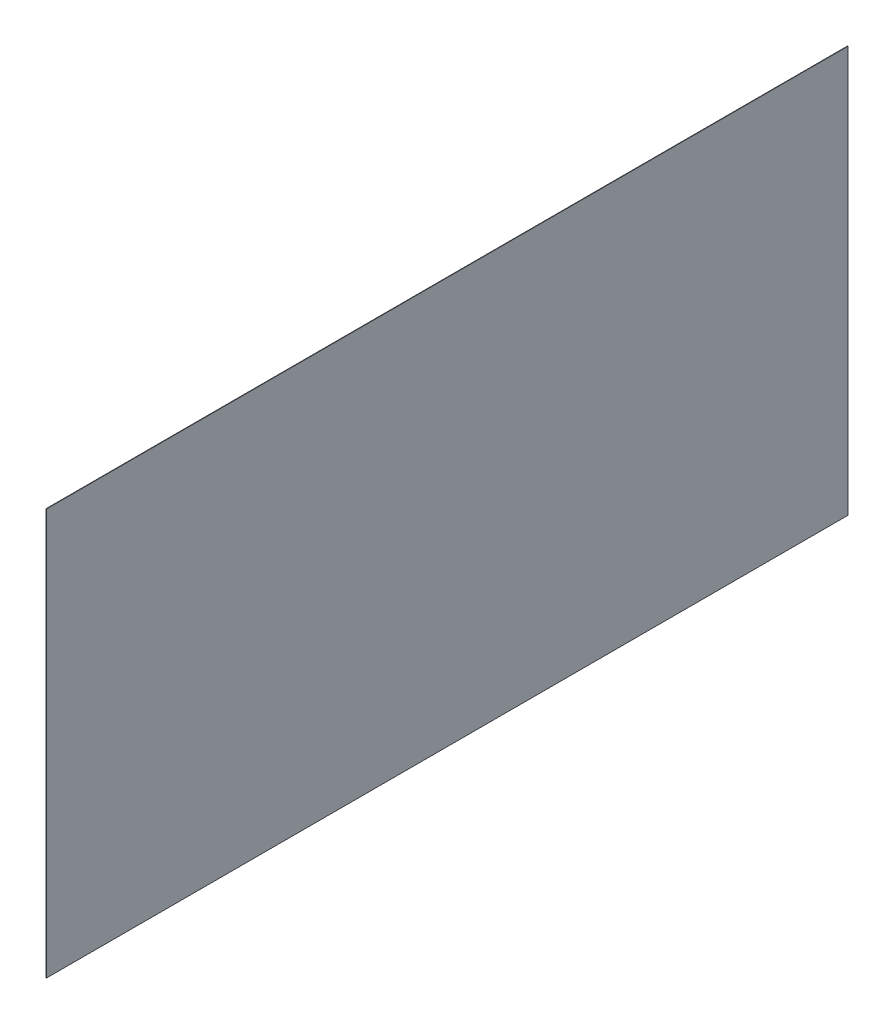
ISO-10303-21;
HEADER;
FILE_DESCRIPTION(('STEP AP214'),'2;1');
FILE_NAME('part.step','',(''),(''),'','','');
FILE_SCHEMA(('AUTOMOTIVE_DESIGN { 1 0 10303 214 1 1 1 1 }'));
ENDSEC;
DATA;
#1=APPLICATION_CONTEXT('core data for automotive mechanical design processes');
#2=APPLICATION_PROTOCOL_DEFINITION('international standard','automotive_design',2000,#1);
#3=PRODUCT_CONTEXT('',#1,'mechanical');
#4=PRODUCT('Part','Part','',(#3));
#5=PRODUCT_RELATED_PRODUCT_CATEGORY('part','',(#4));
#6=PRODUCT_DEFINITION_FORMATION('','',#4);
#7=PRODUCT_DEFINITION_CONTEXT('part definition',#1,'design');
#8=PRODUCT_DEFINITION('design','',#6,#7);
#9=PRODUCT_DEFINITION_SHAPE('','',#8);
#10=(LENGTH_UNIT() NAMED_UNIT(*) SI_UNIT(.MILLI.,.METRE.));
#11=(NAMED_UNIT(*) PLANE_ANGLE_UNIT() SI_UNIT($,.RADIAN.));
#12=(NAMED_UNIT(*) SI_UNIT($,.STERADIAN.) SOLID_ANGLE_UNIT());
#13=UNCERTAINTY_MEASURE_WITH_UNIT(LENGTH_MEASURE(1.E-05),#10,'distance_accuracy_value','');
#14=(GEOMETRIC_REPRESENTATION_CONTEXT(3) GLOBAL_UNCERTAINTY_ASSIGNED_CONTEXT((#13)) GLOBAL_UNIT_ASSIGNED_CONTEXT((#10,
#11,#12)) REPRESENTATION_CONTEXT('',''));
#15=CARTESIAN_POINT('',(0.,0.,0.));
#16=DIRECTION('',(0.,0.,1.));
#17=DIRECTION('',(1.,0.,0.));
#18=AXIS2_PLACEMENT_3D('',#15,#16,#17);
#19=CARTESIAN_POINT('',(-126.4032,-60.,150.));
#20=DIRECTION('',(0.,-1.,0.));
#21=DIRECTION('',(0.,0.,-1.));
#22=AXIS2_PLACEMENT_3D('',#19,#20,#21);
#23=PLANE('',#22);
#24=DIRECTION('',(1.,0.,0.));
#25=VECTOR('',#24,1.);
#26=CARTESIAN_POINT('',(-136.327,-60.,-71.));
#27=LINE('',#26,#25);
#28=CARTESIAN_POINT('',(-126.4032,-60.,-71.));
#29=VERTEX_POINT('',#28);
#30=CARTESIAN_POINT('',(-126.327,-60.,-71.));
#31=VERTEX_POINT('',#30);
#32=EDGE_CURVE('E63',#29,#31,#27,.T.);
#33=ORIENTED_EDGE('',*,*,#32,.T.);
#34=DIRECTION('',(0.,0.,-1.));
#35=VECTOR('',#34,1.);
#36=CARTESIAN_POINT('',(-126.327,-60.,150.));
#37=LINE('',#36,#35);
#38=CARTESIAN_POINT('',(-126.327,-60.,71.));
#39=VERTEX_POINT('',#38);
#40=EDGE_CURVE('E44',#39,#31,#37,.T.);
#41=ORIENTED_EDGE('',*,*,#40,.F.);
#42=DIRECTION('',(1.,0.,0.));
#43=VECTOR('',#42,1.);
#44=CARTESIAN_POINT('',(-136.327,-60.,71.));
#45=LINE('',#44,#43);
#46=CARTESIAN_POINT('',(-126.4032,-60.,71.));
#47=VERTEX_POINT('',#46);
#48=EDGE_CURVE('E55',#47,#39,#45,.T.);
#49=ORIENTED_EDGE('',*,*,#48,.F.);
#50=DIRECTION('',(0.,0.,-1.));
#51=VECTOR('',#50,1.);
#52=CARTESIAN_POINT('',(-126.4032,-60.,150.));
#53=LINE('',#52,#51);
#54=EDGE_CURVE('E11',#47,#29,#53,.T.);
#55=ORIENTED_EDGE('',*,*,#54,.T.);
#56=EDGE_LOOP('',(#33,#41,#49,#55));
#57=FACE_BOUND('',#56,.T.);
#58=ADVANCED_FACE('F41',(#57),#23,.T.);
#59=CARTESIAN_POINT('',(-126.4032,0.,0.));
#60=DIRECTION('',(1.,0.,0.));
#61=DIRECTION('',(0.,0.,-1.));
#62=AXIS2_PLACEMENT_3D('',#59,#60,#61);
#63=PLANE('',#62);
#64=DIRECTION('',(0.,0.,-1.));
#65=VECTOR('',#64,1.);
#66=CARTESIAN_POINT('',(-126.4032,12.,0.));
#67=LINE('',#66,#65);
#68=CARTESIAN_POINT('',(-126.4032,12.,71.));
#69=VERTEX_POINT('',#68);
#70=CARTESIAN_POINT('',(-126.4032,12.,-71.));
#71=VERTEX_POINT('',#70);
#72=EDGE_CURVE('E89',#69,#71,#67,.T.);
#73=ORIENTED_EDGE('',*,*,#72,.T.);
#74=DIRECTION('',(0.,-1.,0.));
#75=VECTOR('',#74,1.);
#76=CARTESIAN_POINT('',(-126.4032,0.,-71.));
#77=LINE('',#76,#75);
#78=EDGE_CURVE('E110',#71,#29,#77,.T.);
#79=ORIENTED_EDGE('',*,*,#78,.T.);
#80=ORIENTED_EDGE('',*,*,#54,.F.);
#81=DIRECTION('',(0.,1.,0.));
#82=VECTOR('',#81,1.);
#83=CARTESIAN_POINT('',(-126.4032,0.,71.));
#84=LINE('',#83,#82);
#85=EDGE_CURVE('E105',#47,#69,#84,.T.);
#86=ORIENTED_EDGE('',*,*,#85,.T.);
#87=EDGE_LOOP('',(#73,#79,#80,#86));
#88=FACE_BOUND('',#87,.T.);
#89=ADVANCED_FACE('F114',(#88),#63,.F.);
#90=CARTESIAN_POINT('',(-126.327,0.,0.));
#91=DIRECTION('',(1.,0.,0.));
#92=DIRECTION('',(0.,0.,-1.));
#93=AXIS2_PLACEMENT_3D('',#90,#91,#92);
#94=PLANE('',#93);
#95=DIRECTION('',(0.,-1.,0.));
#96=VECTOR('',#95,1.);
#97=CARTESIAN_POINT('',(-126.327,12.,-71.));
#98=LINE('',#97,#96);
#99=CARTESIAN_POINT('',(-126.327,12.,-71.));
#100=VERTEX_POINT('',#99);
#101=EDGE_CURVE('E100',#100,#31,#98,.T.);
#102=ORIENTED_EDGE('',*,*,#101,.F.);
#103=DIRECTION('',(0.,0.,-1.));
#104=VECTOR('',#103,1.);
#105=CARTESIAN_POINT('',(-126.327,12.,71.));
#106=LINE('',#105,#104);
#107=CARTESIAN_POINT('',(-126.327,12.,71.));
#108=VERTEX_POINT('',#107);
#109=EDGE_CURVE('E86',#108,#100,#106,.T.);
#110=ORIENTED_EDGE('',*,*,#109,.F.);
#111=DIRECTION('',(0.,1.,0.));
#112=VECTOR('',#111,1.);
#113=CARTESIAN_POINT('',(-126.327,-60.,71.));
#114=LINE('',#113,#112);
#115=EDGE_CURVE('E93',#39,#108,#114,.T.);
#116=ORIENTED_EDGE('',*,*,#115,.F.);
#117=ORIENTED_EDGE('',*,*,#40,.T.);
#118=EDGE_LOOP('',(#102,#110,#116,#117));
#119=FACE_BOUND('',#118,.T.);
#120=ADVANCED_FACE('F99',(#119),#94,.T.);
#121=CARTESIAN_POINT('',(-136.327,12.,-71.));
#122=DIRECTION('',(0.,0.,1.));
#123=DIRECTION('',(1.,0.,0.));
#124=AXIS2_PLACEMENT_3D('',#121,#122,#123);
#125=PLANE('',#124);
#126=DIRECTION('',(1.,0.,0.));
#127=VECTOR('',#126,1.);
#128=CARTESIAN_POINT('',(-136.327,12.,-71.));
#129=LINE('',#128,#127);
#130=EDGE_CURVE('E91',#71,#100,#129,.T.);
#131=ORIENTED_EDGE('',*,*,#130,.T.);
#132=ORIENTED_EDGE('',*,*,#101,.T.);
#133=ORIENTED_EDGE('',*,*,#32,.F.);
#134=ORIENTED_EDGE('',*,*,#78,.F.);
#135=EDGE_LOOP('',(#131,#132,#133,#134));
#136=FACE_BOUND('',#135,.T.);
#137=ADVANCED_FACE('F121',(#136),#125,.F.);
#138=CARTESIAN_POINT('',(-136.327,12.,71.));
#139=DIRECTION('',(0.,-1.,0.));
#140=DIRECTION('',(0.,0.,-1.));
#141=AXIS2_PLACEMENT_3D('',#138,#139,#140);
#142=PLANE('',#141);
#143=DIRECTION('',(1.,0.,0.));
#144=VECTOR('',#143,1.);
#145=CARTESIAN_POINT('',(-136.327,12.,71.));
#146=LINE('',#145,#144);
#147=EDGE_CURVE('E82',#69,#108,#146,.T.);
#148=ORIENTED_EDGE('',*,*,#147,.T.);
#149=ORIENTED_EDGE('',*,*,#109,.T.);
#150=ORIENTED_EDGE('',*,*,#130,.F.);
#151=ORIENTED_EDGE('',*,*,#72,.F.);
#152=EDGE_LOOP('',(#148,#149,#150,#151));
#153=FACE_BOUND('',#152,.T.);
#154=ADVANCED_FACE('F83',(#153),#142,.F.);
#155=CARTESIAN_POINT('',(-136.327,-60.,71.));
#156=DIRECTION('',(0.,0.,-1.));
#157=DIRECTION('',(-1.,0.,0.));
#158=AXIS2_PLACEMENT_3D('',#155,#156,#157);
#159=PLANE('',#158);
#160=ORIENTED_EDGE('',*,*,#48,.T.);
#161=ORIENTED_EDGE('',*,*,#115,.T.);
#162=ORIENTED_EDGE('',*,*,#147,.F.);
#163=ORIENTED_EDGE('',*,*,#85,.F.);
#164=EDGE_LOOP('',(#160,#161,#162,#163));
#165=FACE_BOUND('',#164,.T.);
#166=ADVANCED_FACE('F94',(#165),#159,.F.);
#167=CLOSED_SHELL('',(#58,#89,#120,#137,#154,#166));
#168=MANIFOLD_SOLID_BREP('B2',#167);
#169=ADVANCED_BREP_SHAPE_REPRESENTATION('',(#18,#168),#14);
#170=SHAPE_DEFINITION_REPRESENTATION(#9,#169);
ENDSEC;
END-ISO-10303-21;
